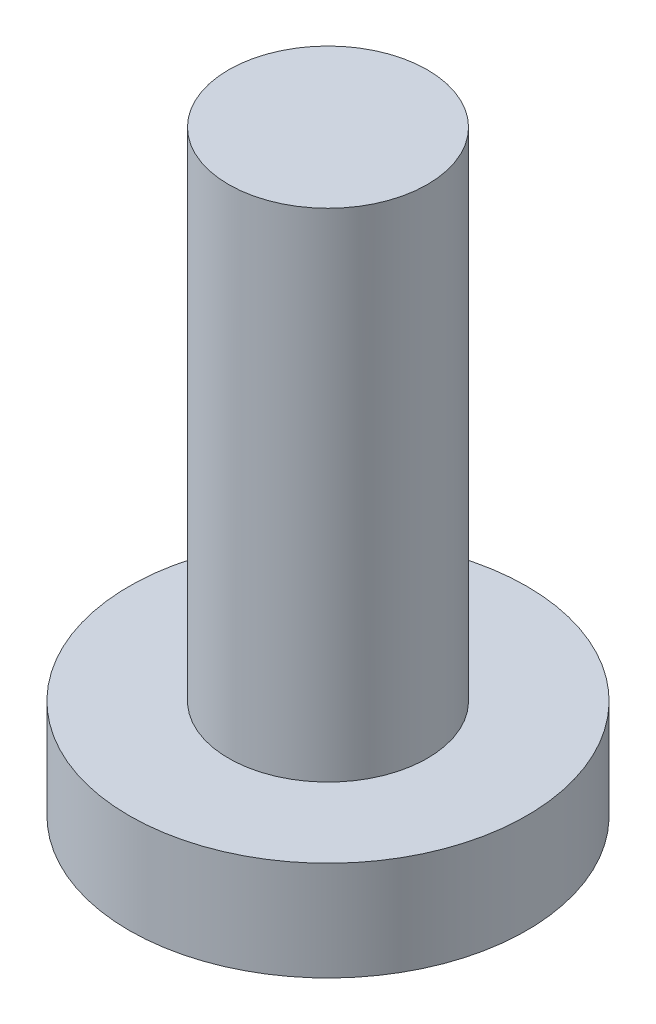
ISO-10303-21;
HEADER;
FILE_DESCRIPTION(('STEP AP214'),'2;1');
FILE_NAME('part.step','',(''),(''),'','','');
FILE_SCHEMA(('AUTOMOTIVE_DESIGN { 1 0 10303 214 1 1 1 1 }'));
ENDSEC;
DATA;
#1=APPLICATION_CONTEXT('core data for automotive mechanical design processes');
#2=APPLICATION_PROTOCOL_DEFINITION('international standard','automotive_design',2000,#1);
#3=PRODUCT_CONTEXT('',#1,'mechanical');
#4=PRODUCT('Part','Part','',(#3));
#5=PRODUCT_RELATED_PRODUCT_CATEGORY('part','',(#4));
#6=PRODUCT_DEFINITION_FORMATION('','',#4);
#7=PRODUCT_DEFINITION_CONTEXT('part definition',#1,'design');
#8=PRODUCT_DEFINITION('design','',#6,#7);
#9=PRODUCT_DEFINITION_SHAPE('','',#8);
#10=(LENGTH_UNIT() NAMED_UNIT(*) SI_UNIT(.MILLI.,.METRE.));
#11=(NAMED_UNIT(*) PLANE_ANGLE_UNIT() SI_UNIT($,.RADIAN.));
#12=(NAMED_UNIT(*) SI_UNIT($,.STERADIAN.) SOLID_ANGLE_UNIT());
#13=UNCERTAINTY_MEASURE_WITH_UNIT(LENGTH_MEASURE(1.E-05),#10,'distance_accuracy_value','');
#14=(GEOMETRIC_REPRESENTATION_CONTEXT(3) GLOBAL_UNCERTAINTY_ASSIGNED_CONTEXT((#13)) GLOBAL_UNIT_ASSIGNED_CONTEXT((#10,
#11,#12)) REPRESENTATION_CONTEXT('',''));
#15=CARTESIAN_POINT('',(0.,0.,0.));
#16=DIRECTION('',(0.,0.,1.));
#17=DIRECTION('',(1.,0.,0.));
#18=AXIS2_PLACEMENT_3D('',#15,#16,#17);
#19=CARTESIAN_POINT('',(0.,5.,0.));
#20=DIRECTION('',(0.,-1.,0.));
#21=DIRECTION('',(0.,0.,-1.));
#22=AXIS2_PLACEMENT_3D('',#19,#20,#21);
#23=CYLINDRICAL_SURFACE('',#22,1.);
#24=CARTESIAN_POINT('',(0.,5.,0.));
#25=DIRECTION('',(0.,1.,0.));
#26=DIRECTION('',(0.,0.,1.));
#27=AXIS2_PLACEMENT_3D('',#24,#25,#26);
#28=CIRCLE('',#27,1.);
#29=CARTESIAN_POINT('',(0.,5.,1.));
#30=VERTEX_POINT('',#29);
#31=EDGE_CURVE('E10',#30,#30,#28,.T.);
#32=ORIENTED_EDGE('',*,*,#31,.F.);
#33=EDGE_LOOP('',(#32));
#34=FACE_BOUND('',#33,.T.);
#35=CARTESIAN_POINT('',(0.,0.,0.));
#36=DIRECTION('',(0.,-1.,0.));
#37=DIRECTION('',(0.,0.,-1.));
#38=AXIS2_PLACEMENT_3D('',#35,#36,#37);
#39=CIRCLE('',#38,1.);
#40=CARTESIAN_POINT('',(0.,0.,-1.));
#41=VERTEX_POINT('',#40);
#42=EDGE_CURVE('E37',#41,#41,#39,.T.);
#43=ORIENTED_EDGE('',*,*,#42,.F.);
#44=EDGE_LOOP('',(#43));
#45=FACE_BOUND('',#44,.T.);
#46=ADVANCED_FACE('F31',(#34,#45),#23,.T.);
#47=CARTESIAN_POINT('',(0.,5.,0.));
#48=DIRECTION('',(0.,1.,0.));
#49=DIRECTION('',(0.,0.,1.));
#50=AXIS2_PLACEMENT_3D('',#47,#48,#49);
#51=PLANE('',#50);
#52=ORIENTED_EDGE('',*,*,#31,.T.);
#53=EDGE_LOOP('',(#52));
#54=FACE_BOUND('',#53,.T.);
#55=ADVANCED_FACE('F64',(#54),#51,.T.);
#56=CARTESIAN_POINT('',(0.,-1.,0.));
#57=DIRECTION('',(0.,1.,0.));
#58=DIRECTION('',(0.,0.,1.));
#59=AXIS2_PLACEMENT_3D('',#56,#57,#58);
#60=CYLINDRICAL_SURFACE('',#59,2.);
#61=CARTESIAN_POINT('',(0.,-1.,0.));
#62=DIRECTION('',(0.,-1.,0.));
#63=DIRECTION('',(0.,0.,-1.));
#64=AXIS2_PLACEMENT_3D('',#61,#62,#63);
#65=CIRCLE('',#64,2.);
#66=CARTESIAN_POINT('',(0.,-1.,-2.));
#67=VERTEX_POINT('',#66);
#68=EDGE_CURVE('E41',#67,#67,#65,.T.);
#69=ORIENTED_EDGE('',*,*,#68,.F.);
#70=EDGE_LOOP('',(#69));
#71=FACE_BOUND('',#70,.T.);
#72=CARTESIAN_POINT('',(0.,0.,0.));
#73=DIRECTION('',(0.,-1.,0.));
#74=DIRECTION('',(0.,0.,-1.));
#75=AXIS2_PLACEMENT_3D('',#72,#73,#74);
#76=CIRCLE('',#75,2.);
#77=CARTESIAN_POINT('',(0.,0.,-2.));
#78=VERTEX_POINT('',#77);
#79=EDGE_CURVE('E45',#78,#78,#76,.T.);
#80=ORIENTED_EDGE('',*,*,#79,.T.);
#81=EDGE_LOOP('',(#80));
#82=FACE_BOUND('',#81,.T.);
#83=ADVANCED_FACE('F51',(#71,#82),#60,.T.);
#84=CARTESIAN_POINT('',(0.,-1.,0.));
#85=DIRECTION('',(0.,-1.,0.));
#86=DIRECTION('',(0.,0.,-1.));
#87=AXIS2_PLACEMENT_3D('',#84,#85,#86);
#88=PLANE('',#87);
#89=ORIENTED_EDGE('',*,*,#68,.T.);
#90=EDGE_LOOP('',(#89));
#91=FACE_BOUND('',#90,.T.);
#92=ADVANCED_FACE('F55',(#91),#88,.T.);
#93=CARTESIAN_POINT('',(0.,0.,0.));
#94=DIRECTION('',(0.,-1.,0.));
#95=DIRECTION('',(0.,0.,-1.));
#96=AXIS2_PLACEMENT_3D('',#93,#94,#95);
#97=PLANE('',#96);
#98=ORIENTED_EDGE('',*,*,#42,.T.);
#99=EDGE_LOOP('',(#98));
#100=FACE_BOUND('',#99,.T.);
#101=ORIENTED_EDGE('',*,*,#79,.F.);
#102=EDGE_LOOP('',(#101));
#103=FACE_BOUND('',#102,.T.);
#104=ADVANCED_FACE('F53',(#100,#103),#97,.F.);
#105=CLOSED_SHELL('',(#46,#55,#83,#92,#104));
#106=MANIFOLD_SOLID_BREP('B2',#105);
#107=ADVANCED_BREP_SHAPE_REPRESENTATION('',(#18,#106),#14);
#108=SHAPE_DEFINITION_REPRESENTATION(#9,#107);
ENDSEC;
END-ISO-10303-21;
